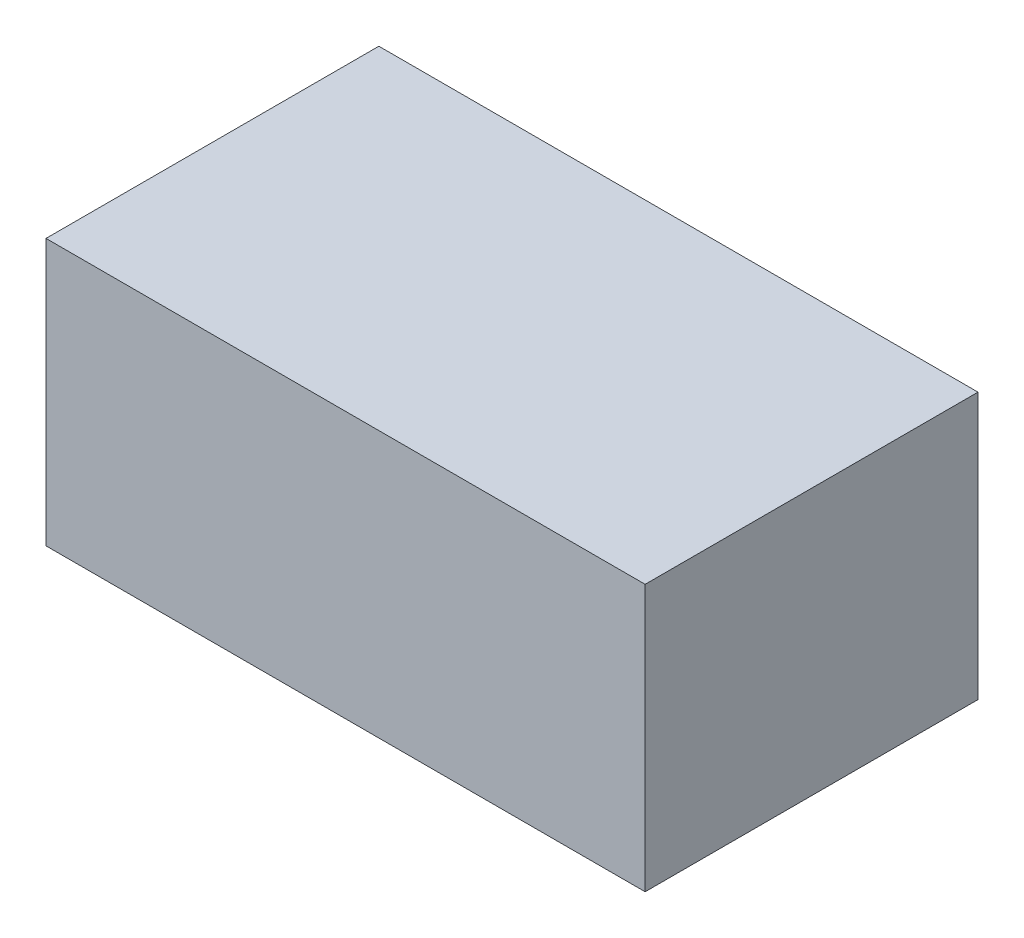
ISO-10303-21;
HEADER;
FILE_DESCRIPTION(('STEP AP214'),'2;1');
FILE_NAME('part.step','',(''),(''),'','','');
FILE_SCHEMA(('AUTOMOTIVE_DESIGN { 1 0 10303 214 1 1 1 1 }'));
ENDSEC;
DATA;
#1=APPLICATION_CONTEXT('core data for automotive mechanical design processes');
#2=APPLICATION_PROTOCOL_DEFINITION('international standard','automotive_design',2000,#1);
#3=PRODUCT_CONTEXT('',#1,'mechanical');
#4=PRODUCT('Part','Part','',(#3));
#5=PRODUCT_RELATED_PRODUCT_CATEGORY('part','',(#4));
#6=PRODUCT_DEFINITION_FORMATION('','',#4);
#7=PRODUCT_DEFINITION_CONTEXT('part definition',#1,'design');
#8=PRODUCT_DEFINITION('design','',#6,#7);
#9=PRODUCT_DEFINITION_SHAPE('','',#8);
#10=(LENGTH_UNIT() NAMED_UNIT(*) SI_UNIT(.MILLI.,.METRE.));
#11=(NAMED_UNIT(*) PLANE_ANGLE_UNIT() SI_UNIT($,.RADIAN.));
#12=(NAMED_UNIT(*) SI_UNIT($,.STERADIAN.) SOLID_ANGLE_UNIT());
#13=UNCERTAINTY_MEASURE_WITH_UNIT(LENGTH_MEASURE(1.E-05),#10,'distance_accuracy_value','');
#14=(GEOMETRIC_REPRESENTATION_CONTEXT(3) GLOBAL_UNCERTAINTY_ASSIGNED_CONTEXT((#13)) GLOBAL_UNIT_ASSIGNED_CONTEXT((#10,
#11,#12)) REPRESENTATION_CONTEXT('',''));
#15=CARTESIAN_POINT('',(0.,0.,0.));
#16=DIRECTION('',(0.,0.,1.));
#17=DIRECTION('',(1.,0.,0.));
#18=AXIS2_PLACEMENT_3D('',#15,#16,#17);
#19=CARTESIAN_POINT('',(36.,16.,-40.));
#20=DIRECTION('',(1.,0.,0.));
#21=DIRECTION('',(0.,1.,0.));
#22=AXIS2_PLACEMENT_3D('',#19,#20,#21);
#23=PLANE('',#22);
#24=DIRECTION('',(0.,1.,0.));
#25=VECTOR('',#24,1.);
#26=CARTESIAN_POINT('',(36.,16.,0.));
#27=LINE('',#26,#25);
#28=CARTESIAN_POINT('',(36.,-16.,0.));
#29=VERTEX_POINT('',#28);
#30=CARTESIAN_POINT('',(36.,16.,0.));
#31=VERTEX_POINT('',#30);
#32=EDGE_CURVE('E101',#29,#31,#27,.T.);
#33=ORIENTED_EDGE('',*,*,#32,.F.);
#34=DIRECTION('',(0.,0.,1.));
#35=VECTOR('',#34,1.);
#36=CARTESIAN_POINT('',(36.,-16.,-40.));
#37=LINE('',#36,#35);
#38=CARTESIAN_POINT('',(36.,-16.,-40.));
#39=VERTEX_POINT('',#38);
#40=EDGE_CURVE('E11',#39,#29,#37,.T.);
#41=ORIENTED_EDGE('',*,*,#40,.F.);
#42=DIRECTION('',(0.,1.,0.));
#43=VECTOR('',#42,1.);
#44=CARTESIAN_POINT('',(36.,16.,-40.));
#45=LINE('',#44,#43);
#46=CARTESIAN_POINT('',(36.,16.,-40.));
#47=VERTEX_POINT('',#46);
#48=EDGE_CURVE('E95',#39,#47,#45,.T.);
#49=ORIENTED_EDGE('',*,*,#48,.T.);
#50=DIRECTION('',(0.,0.,1.));
#51=VECTOR('',#50,1.);
#52=CARTESIAN_POINT('',(36.,16.,-40.));
#53=LINE('',#52,#51);
#54=EDGE_CURVE('E40',#47,#31,#53,.T.);
#55=ORIENTED_EDGE('',*,*,#54,.T.);
#56=EDGE_LOOP('',(#33,#41,#49,#55));
#57=FACE_BOUND('',#56,.T.);
#58=ADVANCED_FACE('F37',(#57),#23,.T.);
#59=CARTESIAN_POINT('',(-36.,-16.,-40.));
#60=DIRECTION('',(0.,-1.,0.));
#61=DIRECTION('',(0.,0.,-1.));
#62=AXIS2_PLACEMENT_3D('',#59,#60,#61);
#63=PLANE('',#62);
#64=DIRECTION('',(1.,0.,0.));
#65=VECTOR('',#64,1.);
#66=CARTESIAN_POINT('',(-36.,-16.,0.));
#67=LINE('',#66,#65);
#68=CARTESIAN_POINT('',(-36.,-16.,0.));
#69=VERTEX_POINT('',#68);
#70=EDGE_CURVE('E97',#69,#29,#67,.T.);
#71=ORIENTED_EDGE('',*,*,#70,.F.);
#72=DIRECTION('',(0.,0.,1.));
#73=VECTOR('',#72,1.);
#74=CARTESIAN_POINT('',(-36.,-16.,-40.));
#75=LINE('',#74,#73);
#76=CARTESIAN_POINT('',(-36.,-16.,-40.));
#77=VERTEX_POINT('',#76);
#78=EDGE_CURVE('E46',#77,#69,#75,.T.);
#79=ORIENTED_EDGE('',*,*,#78,.F.);
#80=DIRECTION('',(1.,0.,0.));
#81=VECTOR('',#80,1.);
#82=CARTESIAN_POINT('',(-36.,-16.,-40.));
#83=LINE('',#82,#81);
#84=EDGE_CURVE('E92',#77,#39,#83,.T.);
#85=ORIENTED_EDGE('',*,*,#84,.T.);
#86=ORIENTED_EDGE('',*,*,#40,.T.);
#87=EDGE_LOOP('',(#71,#79,#85,#86));
#88=FACE_BOUND('',#87,.T.);
#89=ADVANCED_FACE('F111',(#88),#63,.T.);
#90=CARTESIAN_POINT('',(-36.,16.,-40.));
#91=DIRECTION('',(-1.,0.,0.));
#92=DIRECTION('',(0.,-1.,0.));
#93=AXIS2_PLACEMENT_3D('',#90,#91,#92);
#94=PLANE('',#93);
#95=DIRECTION('',(0.,-1.,0.));
#96=VECTOR('',#95,1.);
#97=CARTESIAN_POINT('',(-36.,16.,0.));
#98=LINE('',#97,#96);
#99=CARTESIAN_POINT('',(-36.,16.,0.));
#100=VERTEX_POINT('',#99);
#101=EDGE_CURVE('E87',#100,#69,#98,.T.);
#102=ORIENTED_EDGE('',*,*,#101,.F.);
#103=DIRECTION('',(0.,0.,1.));
#104=VECTOR('',#103,1.);
#105=CARTESIAN_POINT('',(-36.,16.,-40.));
#106=LINE('',#105,#104);
#107=CARTESIAN_POINT('',(-36.,16.,-40.));
#108=VERTEX_POINT('',#107);
#109=EDGE_CURVE('E82',#108,#100,#106,.T.);
#110=ORIENTED_EDGE('',*,*,#109,.F.);
#111=DIRECTION('',(0.,-1.,0.));
#112=VECTOR('',#111,1.);
#113=CARTESIAN_POINT('',(-36.,16.,-40.));
#114=LINE('',#113,#112);
#115=EDGE_CURVE('E85',#108,#77,#114,.T.);
#116=ORIENTED_EDGE('',*,*,#115,.T.);
#117=ORIENTED_EDGE('',*,*,#78,.T.);
#118=EDGE_LOOP('',(#102,#110,#116,#117));
#119=FACE_BOUND('',#118,.T.);
#120=ADVANCED_FACE('F84',(#119),#94,.T.);
#121=CARTESIAN_POINT('',(-36.,16.,-40.));
#122=DIRECTION('',(0.,1.,0.));
#123=DIRECTION('',(0.,0.,1.));
#124=AXIS2_PLACEMENT_3D('',#121,#122,#123);
#125=PLANE('',#124);
#126=DIRECTION('',(-1.,0.,0.));
#127=VECTOR('',#126,1.);
#128=CARTESIAN_POINT('',(-36.,16.,0.));
#129=LINE('',#128,#127);
#130=EDGE_CURVE('E104',#31,#100,#129,.T.);
#131=ORIENTED_EDGE('',*,*,#130,.F.);
#132=ORIENTED_EDGE('',*,*,#54,.F.);
#133=DIRECTION('',(-1.,0.,0.));
#134=VECTOR('',#133,1.);
#135=CARTESIAN_POINT('',(-36.,16.,-40.));
#136=LINE('',#135,#134);
#137=EDGE_CURVE('E91',#47,#108,#136,.T.);
#138=ORIENTED_EDGE('',*,*,#137,.T.);
#139=ORIENTED_EDGE('',*,*,#109,.T.);
#140=EDGE_LOOP('',(#131,#132,#138,#139));
#141=FACE_BOUND('',#140,.T.);
#142=ADVANCED_FACE('F94',(#141),#125,.T.);
#143=CARTESIAN_POINT('',(0.,0.,-40.));
#144=DIRECTION('',(0.,0.,1.));
#145=DIRECTION('',(1.,0.,0.));
#146=AXIS2_PLACEMENT_3D('',#143,#144,#145);
#147=PLANE('',#146);
#148=ORIENTED_EDGE('',*,*,#48,.F.);
#149=ORIENTED_EDGE('',*,*,#84,.F.);
#150=ORIENTED_EDGE('',*,*,#115,.F.);
#151=ORIENTED_EDGE('',*,*,#137,.F.);
#152=EDGE_LOOP('',(#148,#149,#150,#151));
#153=FACE_BOUND('',#152,.T.);
#154=ADVANCED_FACE('F90',(#153),#147,.F.);
#155=CARTESIAN_POINT('',(0.,0.,0.));
#156=DIRECTION('',(0.,0.,1.));
#157=DIRECTION('',(1.,0.,0.));
#158=AXIS2_PLACEMENT_3D('',#155,#156,#157);
#159=PLANE('',#158);
#160=ORIENTED_EDGE('',*,*,#32,.T.);
#161=ORIENTED_EDGE('',*,*,#130,.T.);
#162=ORIENTED_EDGE('',*,*,#101,.T.);
#163=ORIENTED_EDGE('',*,*,#70,.T.);
#164=EDGE_LOOP('',(#160,#161,#162,#163));
#165=FACE_BOUND('',#164,.T.);
#166=ADVANCED_FACE('F110',(#165),#159,.T.);
#167=CLOSED_SHELL('',(#58,#89,#120,#142,#154,#166));
#168=MANIFOLD_SOLID_BREP('B2',#167);
#169=ADVANCED_BREP_SHAPE_REPRESENTATION('',(#18,#168),#14);
#170=SHAPE_DEFINITION_REPRESENTATION(#9,#169);
ENDSEC;
END-ISO-10303-21;
